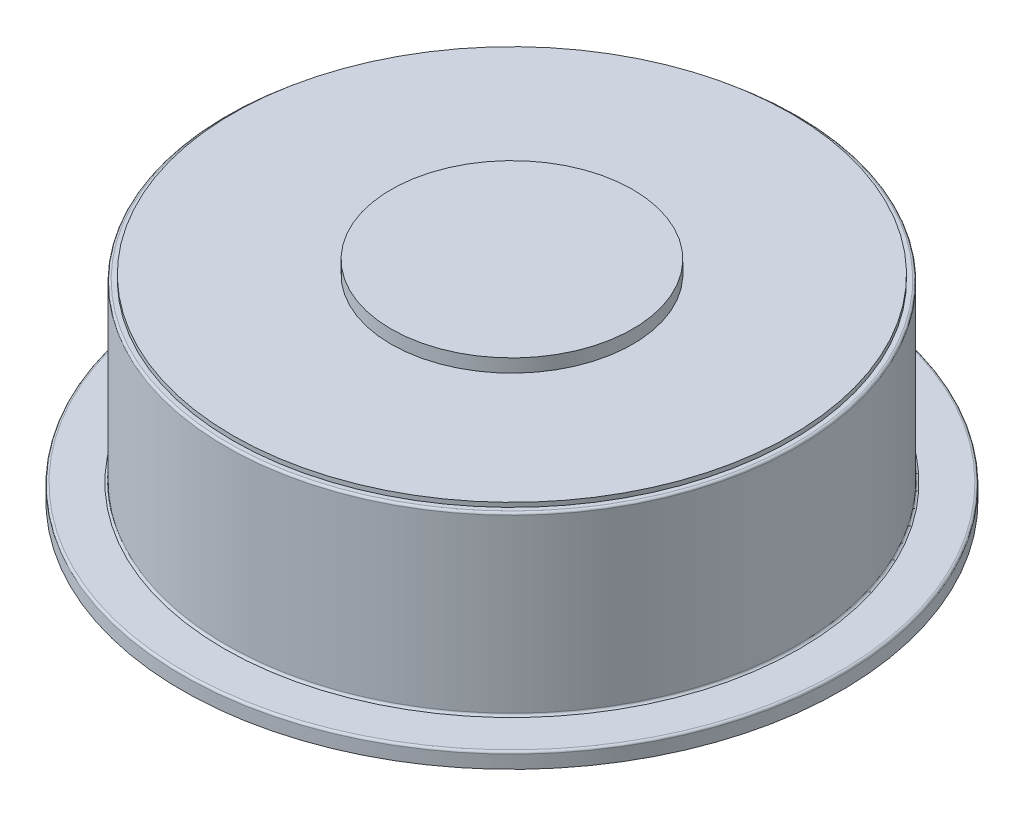
ISO-10303-21;
HEADER;
FILE_DESCRIPTION(('STEP AP214'),'2;1');
FILE_NAME('part.step','',(''),(''),'','','');
FILE_SCHEMA(('AUTOMOTIVE_DESIGN { 1 0 10303 214 1 1 1 1 }'));
ENDSEC;
DATA;
#1=APPLICATION_CONTEXT('core data for automotive mechanical design processes');
#2=APPLICATION_PROTOCOL_DEFINITION('international standard','automotive_design',2000,#1);
#3=PRODUCT_CONTEXT('',#1,'mechanical');
#4=PRODUCT('Part','Part','',(#3));
#5=PRODUCT_RELATED_PRODUCT_CATEGORY('part','',(#4));
#6=PRODUCT_DEFINITION_FORMATION('','',#4);
#7=PRODUCT_DEFINITION_CONTEXT('part definition',#1,'design');
#8=PRODUCT_DEFINITION('design','',#6,#7);
#9=PRODUCT_DEFINITION_SHAPE('','',#8);
#10=(LENGTH_UNIT() NAMED_UNIT(*) SI_UNIT(.MILLI.,.METRE.));
#11=(NAMED_UNIT(*) PLANE_ANGLE_UNIT() SI_UNIT($,.RADIAN.));
#12=(NAMED_UNIT(*) SI_UNIT($,.STERADIAN.) SOLID_ANGLE_UNIT());
#13=UNCERTAINTY_MEASURE_WITH_UNIT(LENGTH_MEASURE(1.E-05),#10,'distance_accuracy_value','');
#14=(GEOMETRIC_REPRESENTATION_CONTEXT(3) GLOBAL_UNCERTAINTY_ASSIGNED_CONTEXT((#13)) GLOBAL_UNIT_ASSIGNED_CONTEXT((#10,
#11,#12)) REPRESENTATION_CONTEXT('',''));
#15=CARTESIAN_POINT('',(0.,0.,0.));
#16=DIRECTION('',(0.,0.,1.));
#17=DIRECTION('',(1.,0.,0.));
#18=AXIS2_PLACEMENT_3D('',#15,#16,#17);
#19=CARTESIAN_POINT('',(0.,0.,0.));
#20=DIRECTION('',(0.,-1.,0.));
#21=DIRECTION('',(0.,0.,-1.));
#22=AXIS2_PLACEMENT_3D('',#19,#20,#21);
#23=PLANE('',#22);
#24=CARTESIAN_POINT('',(0.,0.,0.));
#25=DIRECTION('',(0.,-1.,0.));
#26=DIRECTION('',(0.,0.,-1.));
#27=AXIS2_PLACEMENT_3D('',#24,#25,#26);
#28=CIRCLE('',#27,150.);
#29=CARTESIAN_POINT('',(0.,0.,-150.));
#30=VERTEX_POINT('',#29);
#31=EDGE_CURVE('E54',#30,#30,#28,.T.);
#32=ORIENTED_EDGE('',*,*,#31,.T.);
#33=EDGE_LOOP('',(#32));
#34=FACE_BOUND('',#33,.T.);
#35=ADVANCED_FACE('F35',(#34),#23,.T.);
#36=CARTESIAN_POINT('',(0.,7.,0.));
#37=DIRECTION('',(0.,-1.,0.));
#38=DIRECTION('',(0.,0.,-1.));
#39=AXIS2_PLACEMENT_3D('',#36,#37,#38);
#40=CYLINDRICAL_SURFACE('',#39,150.);
#41=CARTESIAN_POINT('',(0.,5.99999999999999,0.));
#42=DIRECTION('',(0.,-1.,0.));
#43=DIRECTION('',(0.,0.,-1.));
#44=AXIS2_PLACEMENT_3D('',#41,#42,#43);
#45=CIRCLE('',#44,150.);
#46=CARTESIAN_POINT('',(0.,5.99999999999999,-150.));
#47=VERTEX_POINT('',#46);
#48=EDGE_CURVE('E47',#47,#47,#45,.T.);
#49=ORIENTED_EDGE('',*,*,#48,.T.);
#50=EDGE_LOOP('',(#49));
#51=FACE_BOUND('',#50,.T.);
#52=ORIENTED_EDGE('',*,*,#31,.F.);
#53=EDGE_LOOP('',(#52));
#54=FACE_BOUND('',#53,.T.);
#55=ADVANCED_FACE('F74',(#51,#54),#40,.T.);
#56=CARTESIAN_POINT('',(0.,6.99999999999999,0.));
#57=DIRECTION('',(0.,-1.,0.));
#58=DIRECTION('',(0.,0.,-1.));
#59=AXIS2_PLACEMENT_3D('',#56,#57,#58);
#60=PLANE('',#59);
#61=CARTESIAN_POINT('',(0.,6.99999999999999,0.));
#62=DIRECTION('',(0.,-1.,0.));
#63=DIRECTION('',(0.,0.,-1.));
#64=AXIS2_PLACEMENT_3D('',#61,#62,#63);
#65=CIRCLE('',#64,149.);
#66=CARTESIAN_POINT('',(0.,6.99999999999999,-149.));
#67=VERTEX_POINT('',#66);
#68=EDGE_CURVE('E39',#67,#67,#65,.F.);
#69=ORIENTED_EDGE('',*,*,#68,.T.);
#70=EDGE_LOOP('',(#69));
#71=FACE_BOUND('',#70,.T.);
#72=CARTESIAN_POINT('',(0.,6.99999999999999,0.));
#73=DIRECTION('',(0.,-1.,0.));
#74=DIRECTION('',(0.,0.,-1.));
#75=AXIS2_PLACEMENT_3D('',#72,#73,#74);
#76=CIRCLE('',#75,131.);
#77=CARTESIAN_POINT('',(0.,6.99999999999999,-131.));
#78=VERTEX_POINT('',#77);
#79=EDGE_CURVE('E58',#78,#78,#76,.T.);
#80=ORIENTED_EDGE('',*,*,#79,.T.);
#81=EDGE_LOOP('',(#80));
#82=FACE_BOUND('',#81,.T.);
#83=ADVANCED_FACE('F97',(#71,#82),#60,.F.);
#84=CARTESIAN_POINT('',(0.,87.,0.));
#85=DIRECTION('',(0.,-1.,0.));
#86=DIRECTION('',(0.,0.,-1.));
#87=AXIS2_PLACEMENT_3D('',#84,#85,#86);
#88=PLANE('',#87);
#89=CARTESIAN_POINT('',(0.,87.,0.));
#90=DIRECTION('',(0.,-1.,0.));
#91=DIRECTION('',(0.,0.,-1.));
#92=AXIS2_PLACEMENT_3D('',#89,#90,#91);
#93=CIRCLE('',#92,129.);
#94=CARTESIAN_POINT('',(0.,87.,-129.));
#95=VERTEX_POINT('',#94);
#96=EDGE_CURVE('E69',#95,#95,#93,.F.);
#97=ORIENTED_EDGE('',*,*,#96,.T.);
#98=EDGE_LOOP('',(#97));
#99=FACE_BOUND('',#98,.T.);
#100=CARTESIAN_POINT('',(0.,87.,0.));
#101=DIRECTION('',(0.,1.,0.));
#102=DIRECTION('',(0.,0.,1.));
#103=AXIS2_PLACEMENT_3D('',#100,#101,#102);
#104=CIRCLE('',#103,127.);
#105=CARTESIAN_POINT('',(0.,87.,127.));
#106=VERTEX_POINT('',#105);
#107=EDGE_CURVE('E55',#106,#106,#104,.T.);
#108=ORIENTED_EDGE('',*,*,#107,.F.);
#109=EDGE_LOOP('',(#108));
#110=FACE_BOUND('',#109,.T.);
#111=ADVANCED_FACE('F102',(#99,#110),#88,.F.);
#112=CARTESIAN_POINT('',(0.,7.,0.));
#113=DIRECTION('',(0.,-1.,0.));
#114=DIRECTION('',(0.,0.,-1.));
#115=AXIS2_PLACEMENT_3D('',#112,#113,#114);
#116=CYLINDRICAL_SURFACE('',#115,130.);
#117=CARTESIAN_POINT('',(0.,7.99999999999999,0.));
#118=DIRECTION('',(0.,-1.,0.));
#119=DIRECTION('',(0.,0.,-1.));
#120=AXIS2_PLACEMENT_3D('',#117,#118,#119);
#121=CIRCLE('',#120,130.);
#122=CARTESIAN_POINT('',(0.,7.99999999999999,-130.));
#123=VERTEX_POINT('',#122);
#124=EDGE_CURVE('E66',#123,#123,#121,.F.);
#125=ORIENTED_EDGE('',*,*,#124,.T.);
#126=EDGE_LOOP('',(#125));
#127=FACE_BOUND('',#126,.T.);
#128=CARTESIAN_POINT('',(0.,86.,0.));
#129=DIRECTION('',(0.,-1.,0.));
#130=DIRECTION('',(0.,0.,-1.));
#131=AXIS2_PLACEMENT_3D('',#128,#129,#130);
#132=CIRCLE('',#131,130.);
#133=CARTESIAN_POINT('',(0.,86.,-130.));
#134=VERTEX_POINT('',#133);
#135=EDGE_CURVE('E63',#134,#134,#132,.T.);
#136=ORIENTED_EDGE('',*,*,#135,.T.);
#137=EDGE_LOOP('',(#136));
#138=FACE_BOUND('',#137,.T.);
#139=ADVANCED_FACE('F105',(#127,#138),#116,.T.);
#140=CARTESIAN_POINT('',(0.,89.,0.));
#141=DIRECTION('',(0.,-1.,0.));
#142=DIRECTION('',(0.,0.,-1.));
#143=AXIS2_PLACEMENT_3D('',#140,#141,#142);
#144=CYLINDRICAL_SURFACE('',#143,127.);
#145=CARTESIAN_POINT('',(0.,89.,0.));
#146=DIRECTION('',(0.,1.,0.));
#147=DIRECTION('',(0.,0.,1.));
#148=AXIS2_PLACEMENT_3D('',#145,#146,#147);
#149=CIRCLE('',#148,127.);
#150=CARTESIAN_POINT('',(0.,89.,127.));
#151=VERTEX_POINT('',#150);
#152=EDGE_CURVE('E51',#151,#151,#149,.T.);
#153=ORIENTED_EDGE('',*,*,#152,.F.);
#154=EDGE_LOOP('',(#153));
#155=FACE_BOUND('',#154,.T.);
#156=ORIENTED_EDGE('',*,*,#107,.T.);
#157=EDGE_LOOP('',(#156));
#158=FACE_BOUND('',#157,.T.);
#159=ADVANCED_FACE('F107',(#155,#158),#144,.T.);
#160=CARTESIAN_POINT('',(0.,89.,0.));
#161=DIRECTION('',(0.,1.,0.));
#162=DIRECTION('',(0.,0.,1.));
#163=AXIS2_PLACEMENT_3D('',#160,#161,#162);
#164=PLANE('',#163);
#165=CARTESIAN_POINT('',(0.,89.,0.));
#166=DIRECTION('',(0.,1.,0.));
#167=DIRECTION('',(0.,0.,1.));
#168=AXIS2_PLACEMENT_3D('',#165,#166,#167);
#169=CIRCLE('',#168,55.);
#170=CARTESIAN_POINT('',(0.,89.,55.));
#171=VERTEX_POINT('',#170);
#172=EDGE_CURVE('E10',#171,#171,#169,.T.);
#173=ORIENTED_EDGE('',*,*,#172,.F.);
#174=EDGE_LOOP('',(#173));
#175=FACE_BOUND('',#174,.T.);
#176=ORIENTED_EDGE('',*,*,#152,.T.);
#177=EDGE_LOOP('',(#176));
#178=FACE_BOUND('',#177,.T.);
#179=ADVANCED_FACE('F112',(#175,#178),#164,.T.);
#180=CARTESIAN_POINT('',(0.,7.99999999999999,0.));
#181=DIRECTION('',(0.,-1.,0.));
#182=DIRECTION('',(0.,0.,-1.));
#183=AXIS2_PLACEMENT_3D('',#180,#181,#182);
#184=TOROIDAL_SURFACE('',#183,131.,1.);
#185=ORIENTED_EDGE('',*,*,#124,.F.);
#186=EDGE_LOOP('',(#185));
#187=FACE_BOUND('',#186,.T.);
#188=ORIENTED_EDGE('',*,*,#79,.F.);
#189=EDGE_LOOP('',(#188));
#190=FACE_BOUND('',#189,.T.);
#191=ADVANCED_FACE('F88',(#187,#190),#184,.F.);
#192=CARTESIAN_POINT('',(0.,86.,0.));
#193=DIRECTION('',(0.,-1.,0.));
#194=DIRECTION('',(0.,0.,-1.));
#195=AXIS2_PLACEMENT_3D('',#192,#193,#194);
#196=TOROIDAL_SURFACE('',#195,129.,1.);
#197=ORIENTED_EDGE('',*,*,#96,.F.);
#198=EDGE_LOOP('',(#197));
#199=FACE_BOUND('',#198,.T.);
#200=ORIENTED_EDGE('',*,*,#135,.F.);
#201=EDGE_LOOP('',(#200));
#202=FACE_BOUND('',#201,.T.);
#203=ADVANCED_FACE('F79',(#199,#202),#196,.T.);
#204=CARTESIAN_POINT('',(0.,5.99999999999999,0.));
#205=DIRECTION('',(0.,-1.,0.));
#206=DIRECTION('',(0.,0.,-1.));
#207=AXIS2_PLACEMENT_3D('',#204,#205,#206);
#208=TOROIDAL_SURFACE('',#207,149.,1.);
#209=ORIENTED_EDGE('',*,*,#68,.F.);
#210=EDGE_LOOP('',(#209));
#211=FACE_BOUND('',#210,.T.);
#212=ORIENTED_EDGE('',*,*,#48,.F.);
#213=EDGE_LOOP('',(#212));
#214=FACE_BOUND('',#213,.T.);
#215=ADVANCED_FACE('F37',(#211,#214),#208,.T.);
#216=CARTESIAN_POINT('',(0.,95.,0.));
#217=DIRECTION('',(0.,-1.,0.));
#218=DIRECTION('',(0.,0.,-1.));
#219=AXIS2_PLACEMENT_3D('',#216,#217,#218);
#220=CYLINDRICAL_SURFACE('',#219,55.);
#221=CARTESIAN_POINT('',(0.,95.,0.));
#222=DIRECTION('',(0.,1.,0.));
#223=DIRECTION('',(0.,0.,1.));
#224=AXIS2_PLACEMENT_3D('',#221,#222,#223);
#225=CIRCLE('',#224,55.);
#226=CARTESIAN_POINT('',(0.,95.,55.));
#227=VERTEX_POINT('',#226);
#228=EDGE_CURVE('E50',#227,#227,#225,.T.);
#229=ORIENTED_EDGE('',*,*,#228,.F.);
#230=EDGE_LOOP('',(#229));
#231=FACE_BOUND('',#230,.T.);
#232=ORIENTED_EDGE('',*,*,#172,.T.);
#233=EDGE_LOOP('',(#232));
#234=FACE_BOUND('',#233,.T.);
#235=ADVANCED_FACE('F78',(#231,#234),#220,.T.);
#236=CARTESIAN_POINT('',(0.,95.,0.));
#237=DIRECTION('',(0.,1.,0.));
#238=DIRECTION('',(0.,0.,1.));
#239=AXIS2_PLACEMENT_3D('',#236,#237,#238);
#240=PLANE('',#239);
#241=ORIENTED_EDGE('',*,*,#228,.T.);
#242=EDGE_LOOP('',(#241));
#243=FACE_BOUND('',#242,.T.);
#244=ADVANCED_FACE('F85',(#243),#240,.T.);
#245=CLOSED_SHELL('',(#35,#55,#83,#111,#139,#159,#179,#191,#203,#215,#235,#244));
#246=MANIFOLD_SOLID_BREP('B2',#245);
#247=ADVANCED_BREP_SHAPE_REPRESENTATION('',(#18,#246),#14);
#248=SHAPE_DEFINITION_REPRESENTATION(#9,#247);
ENDSEC;
END-ISO-10303-21;
